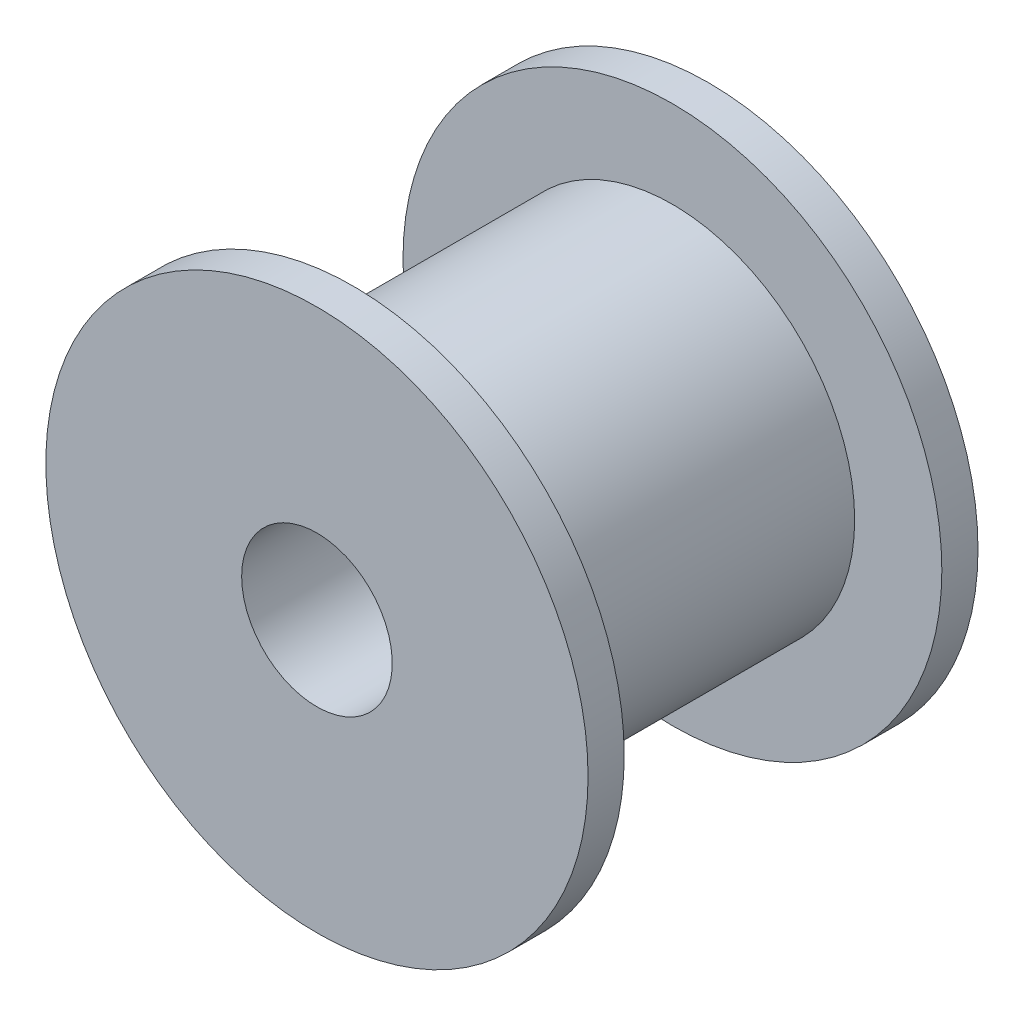
ISO-10303-21;
HEADER;
FILE_DESCRIPTION(('STEP AP214'),'2;1');
FILE_NAME('part.step','',(''),(''),'','','');
FILE_SCHEMA(('AUTOMOTIVE_DESIGN { 1 0 10303 214 1 1 1 1 }'));
ENDSEC;
DATA;
#1=APPLICATION_CONTEXT('core data for automotive mechanical design processes');
#2=APPLICATION_PROTOCOL_DEFINITION('international standard','automotive_design',2000,#1);
#3=PRODUCT_CONTEXT('',#1,'mechanical');
#4=PRODUCT('Part','Part','',(#3));
#5=PRODUCT_RELATED_PRODUCT_CATEGORY('part','',(#4));
#6=PRODUCT_DEFINITION_FORMATION('','',#4);
#7=PRODUCT_DEFINITION_CONTEXT('part definition',#1,'design');
#8=PRODUCT_DEFINITION('design','',#6,#7);
#9=PRODUCT_DEFINITION_SHAPE('','',#8);
#10=(LENGTH_UNIT() NAMED_UNIT(*) SI_UNIT(.MILLI.,.METRE.));
#11=(NAMED_UNIT(*) PLANE_ANGLE_UNIT() SI_UNIT($,.RADIAN.));
#12=(NAMED_UNIT(*) SI_UNIT($,.STERADIAN.) SOLID_ANGLE_UNIT());
#13=UNCERTAINTY_MEASURE_WITH_UNIT(LENGTH_MEASURE(1.E-05),#10,'distance_accuracy_value','');
#14=(GEOMETRIC_REPRESENTATION_CONTEXT(3) GLOBAL_UNCERTAINTY_ASSIGNED_CONTEXT((#13)) GLOBAL_UNIT_ASSIGNED_CONTEXT((#10,
#11,#12)) REPRESENTATION_CONTEXT('',''));
#15=CARTESIAN_POINT('',(0.,0.,0.));
#16=DIRECTION('',(0.,0.,1.));
#17=DIRECTION('',(1.,0.,0.));
#18=AXIS2_PLACEMENT_3D('',#15,#16,#17);
#19=CARTESIAN_POINT('',(0.,0.,13.));
#20=DIRECTION('',(0.,0.,1.));
#21=DIRECTION('',(1.,0.,0.));
#22=AXIS2_PLACEMENT_3D('',#19,#20,#21);
#23=PLANE('',#22);
#24=CARTESIAN_POINT('',(0.,0.,13.));
#25=DIRECTION('',(0.,0.,-1.));
#26=DIRECTION('',(-1.,0.,0.));
#27=AXIS2_PLACEMENT_3D('',#24,#25,#26);
#28=CIRCLE('',#27,2.5);
#29=CARTESIAN_POINT('',(-2.5,0.,13.));
#30=VERTEX_POINT('',#29);
#31=EDGE_CURVE('E82',#30,#30,#28,.T.);
#32=ORIENTED_EDGE('',*,*,#31,.T.);
#33=EDGE_LOOP('',(#32));
#34=FACE_BOUND('',#33,.T.);
#35=CARTESIAN_POINT('',(0.,0.,13.));
#36=DIRECTION('',(0.,0.,-1.));
#37=DIRECTION('',(1.,0.,0.));
#38=AXIS2_PLACEMENT_3D('',#35,#36,#37);
#39=CIRCLE('',#38,9.);
#40=CARTESIAN_POINT('',(9.,0.,13.));
#41=VERTEX_POINT('',#40);
#42=EDGE_CURVE('E11',#41,#41,#39,.T.);
#43=ORIENTED_EDGE('',*,*,#42,.F.);
#44=EDGE_LOOP('',(#43));
#45=FACE_BOUND('',#44,.T.);
#46=ADVANCED_FACE('F16',(#34,#45),#23,.T.);
#47=CARTESIAN_POINT('',(0.,0.,0.));
#48=DIRECTION('',(0.,0.,1.));
#49=DIRECTION('',(1.,0.,0.));
#50=AXIS2_PLACEMENT_3D('',#47,#48,#49);
#51=PLANE('',#50);
#52=CARTESIAN_POINT('',(0.,0.,0.));
#53=DIRECTION('',(0.,0.,1.));
#54=DIRECTION('',(-1.,0.,0.));
#55=AXIS2_PLACEMENT_3D('',#52,#53,#54);
#56=CIRCLE('',#55,2.5);
#57=CARTESIAN_POINT('',(-2.5,0.,0.));
#58=VERTEX_POINT('',#57);
#59=EDGE_CURVE('E81',#58,#58,#56,.T.);
#60=ORIENTED_EDGE('',*,*,#59,.T.);
#61=EDGE_LOOP('',(#60));
#62=FACE_BOUND('',#61,.T.);
#63=CARTESIAN_POINT('',(0.,0.,0.));
#64=DIRECTION('',(0.,0.,1.));
#65=DIRECTION('',(-1.,0.,0.));
#66=AXIS2_PLACEMENT_3D('',#63,#64,#65);
#67=CIRCLE('',#66,8.94427190999916);
#68=CARTESIAN_POINT('',(-8.94427190999916,0.,0.));
#69=VERTEX_POINT('',#68);
#70=EDGE_CURVE('E66',#69,#69,#67,.T.);
#71=ORIENTED_EDGE('',*,*,#70,.F.);
#72=EDGE_LOOP('',(#71));
#73=FACE_BOUND('',#72,.T.);
#74=ADVANCED_FACE('F106',(#62,#73),#51,.F.);
#75=CARTESIAN_POINT('',(0.,0.,0.));
#76=DIRECTION('',(0.,0.,1.));
#77=DIRECTION('',(-1.,0.,0.));
#78=AXIS2_PLACEMENT_3D('',#75,#76,#77);
#79=CYLINDRICAL_SURFACE('',#78,6.05);
#80=CARTESIAN_POINT('',(0.,0.,11.8));
#81=DIRECTION('',(0.,0.,-1.));
#82=DIRECTION('',(1.,0.,0.));
#83=AXIS2_PLACEMENT_3D('',#80,#81,#82);
#84=CIRCLE('',#83,6.05);
#85=CARTESIAN_POINT('',(6.05,0.,11.8));
#86=VERTEX_POINT('',#85);
#87=EDGE_CURVE('E27',#86,#86,#84,.T.);
#88=ORIENTED_EDGE('',*,*,#87,.T.);
#89=EDGE_LOOP('',(#88));
#90=FACE_BOUND('',#89,.T.);
#91=CARTESIAN_POINT('',(0.,0.,1.2));
#92=DIRECTION('',(0.,0.,1.));
#93=DIRECTION('',(1.,0.,0.));
#94=AXIS2_PLACEMENT_3D('',#91,#92,#93);
#95=CIRCLE('',#94,6.05);
#96=CARTESIAN_POINT('',(6.05,0.,1.2));
#97=VERTEX_POINT('',#96);
#98=EDGE_CURVE('E70',#97,#97,#95,.T.);
#99=ORIENTED_EDGE('',*,*,#98,.T.);
#100=EDGE_LOOP('',(#99));
#101=FACE_BOUND('',#100,.T.);
#102=ADVANCED_FACE('F90',(#90,#101),#79,.T.);
#103=CARTESIAN_POINT('',(0.,0.,13.));
#104=DIRECTION('',(0.,0.,-1.));
#105=DIRECTION('',(-1.,0.,0.));
#106=AXIS2_PLACEMENT_3D('',#103,#104,#105);
#107=CYLINDRICAL_SURFACE('',#106,9.);
#108=ORIENTED_EDGE('',*,*,#42,.T.);
#109=EDGE_LOOP('',(#108));
#110=FACE_BOUND('',#109,.T.);
#111=CARTESIAN_POINT('',(0.,0.,11.8));
#112=DIRECTION('',(0.,0.,-1.));
#113=DIRECTION('',(1.,0.,0.));
#114=AXIS2_PLACEMENT_3D('',#111,#112,#113);
#115=CIRCLE('',#114,9.);
#116=CARTESIAN_POINT('',(9.,0.,11.8));
#117=VERTEX_POINT('',#116);
#118=EDGE_CURVE('E59',#117,#117,#115,.T.);
#119=ORIENTED_EDGE('',*,*,#118,.F.);
#120=EDGE_LOOP('',(#119));
#121=FACE_BOUND('',#120,.T.);
#122=ADVANCED_FACE('F95',(#110,#121),#107,.T.);
#123=CARTESIAN_POINT('',(0.,0.,11.8));
#124=DIRECTION('',(0.,0.,1.));
#125=DIRECTION('',(1.,0.,0.));
#126=AXIS2_PLACEMENT_3D('',#123,#124,#125);
#127=PLANE('',#126);
#128=ORIENTED_EDGE('',*,*,#87,.F.);
#129=EDGE_LOOP('',(#128));
#130=FACE_BOUND('',#129,.T.);
#131=ORIENTED_EDGE('',*,*,#118,.T.);
#132=EDGE_LOOP('',(#131));
#133=FACE_BOUND('',#132,.T.);
#134=ADVANCED_FACE('F93',(#130,#133),#127,.F.);
#135=CARTESIAN_POINT('',(0.,0.,0.));
#136=DIRECTION('',(0.,0.,1.));
#137=DIRECTION('',(1.,0.,0.));
#138=AXIS2_PLACEMENT_3D('',#135,#136,#137);
#139=CYLINDRICAL_SURFACE('',#138,8.94427190999916);
#140=CARTESIAN_POINT('',(0.,0.,1.2));
#141=DIRECTION('',(0.,0.,1.));
#142=DIRECTION('',(-1.,0.,0.));
#143=AXIS2_PLACEMENT_3D('',#140,#141,#142);
#144=CIRCLE('',#143,8.94427190999916);
#145=CARTESIAN_POINT('',(-8.94427190999916,0.,1.2));
#146=VERTEX_POINT('',#145);
#147=EDGE_CURVE('E20',#146,#146,#144,.T.);
#148=ORIENTED_EDGE('',*,*,#147,.F.);
#149=EDGE_LOOP('',(#148));
#150=FACE_BOUND('',#149,.T.);
#151=ORIENTED_EDGE('',*,*,#70,.T.);
#152=EDGE_LOOP('',(#151));
#153=FACE_BOUND('',#152,.T.);
#154=ADVANCED_FACE('F67',(#150,#153),#139,.T.);
#155=CARTESIAN_POINT('',(0.,0.,1.2));
#156=DIRECTION('',(0.,0.,1.));
#157=DIRECTION('',(1.,0.,0.));
#158=AXIS2_PLACEMENT_3D('',#155,#156,#157);
#159=PLANE('',#158);
#160=ORIENTED_EDGE('',*,*,#98,.F.);
#161=EDGE_LOOP('',(#160));
#162=FACE_BOUND('',#161,.T.);
#163=ORIENTED_EDGE('',*,*,#147,.T.);
#164=EDGE_LOOP('',(#163));
#165=FACE_BOUND('',#164,.T.);
#166=ADVANCED_FACE('F18',(#162,#165),#159,.T.);
#167=CARTESIAN_POINT('',(0.,0.,0.));
#168=DIRECTION('',(0.,0.,1.));
#169=DIRECTION('',(1.,0.,0.));
#170=AXIS2_PLACEMENT_3D('',#167,#168,#169);
#171=CYLINDRICAL_SURFACE('',#170,2.5);
#172=ORIENTED_EDGE('',*,*,#31,.F.);
#173=EDGE_LOOP('',(#172));
#174=FACE_BOUND('',#173,.T.);
#175=ORIENTED_EDGE('',*,*,#59,.F.);
#176=EDGE_LOOP('',(#175));
#177=FACE_BOUND('',#176,.T.);
#178=ADVANCED_FACE('F115',(#174,#177),#171,.F.);
#179=CLOSED_SHELL('',(#46,#74,#102,#122,#134,#154,#166,#178));
#180=MANIFOLD_SOLID_BREP('B1',#179);
#181=ADVANCED_BREP_SHAPE_REPRESENTATION('',(#18,#180),#14);
#182=SHAPE_DEFINITION_REPRESENTATION(#9,#181);
ENDSEC;
END-ISO-10303-21;
